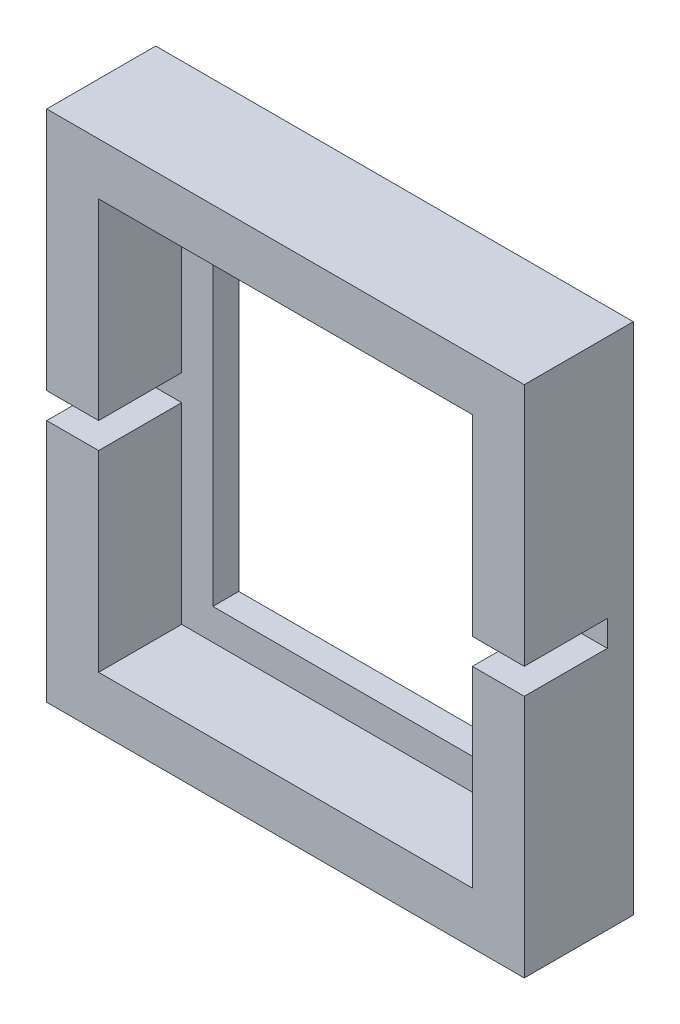
ISO-10303-21;
HEADER;
FILE_DESCRIPTION(('STEP AP214'),'2;1');
FILE_NAME('part.step','',(''),(''),'','','');
FILE_SCHEMA(('AUTOMOTIVE_DESIGN { 1 0 10303 214 1 1 1 1 }'));
ENDSEC;
DATA;
#1=APPLICATION_CONTEXT('core data for automotive mechanical design processes');
#2=APPLICATION_PROTOCOL_DEFINITION('international standard','automotive_design',2000,#1);
#3=PRODUCT_CONTEXT('',#1,'mechanical');
#4=PRODUCT('Part','Part','',(#3));
#5=PRODUCT_RELATED_PRODUCT_CATEGORY('part','',(#4));
#6=PRODUCT_DEFINITION_FORMATION('','',#4);
#7=PRODUCT_DEFINITION_CONTEXT('part definition',#1,'design');
#8=PRODUCT_DEFINITION('design','',#6,#7);
#9=PRODUCT_DEFINITION_SHAPE('','',#8);
#10=(LENGTH_UNIT() NAMED_UNIT(*) SI_UNIT(.MILLI.,.METRE.));
#11=(NAMED_UNIT(*) PLANE_ANGLE_UNIT() SI_UNIT($,.RADIAN.));
#12=(NAMED_UNIT(*) SI_UNIT($,.STERADIAN.) SOLID_ANGLE_UNIT());
#13=UNCERTAINTY_MEASURE_WITH_UNIT(LENGTH_MEASURE(1.E-05),#10,'distance_accuracy_value','');
#14=(GEOMETRIC_REPRESENTATION_CONTEXT(3) GLOBAL_UNCERTAINTY_ASSIGNED_CONTEXT((#13)) GLOBAL_UNIT_ASSIGNED_CONTEXT((#10,
#11,#12)) REPRESENTATION_CONTEXT('',''));
#15=CARTESIAN_POINT('',(0.,0.,0.));
#16=DIRECTION('',(0.,0.,1.));
#17=DIRECTION('',(1.,0.,0.));
#18=AXIS2_PLACEMENT_3D('',#15,#16,#17);
#19=CARTESIAN_POINT('',(0.,0.,0.));
#20=DIRECTION('',(0.,0.,-1.));
#21=DIRECTION('',(-1.,0.,0.));
#22=AXIS2_PLACEMENT_3D('',#19,#20,#21);
#23=PLANE('',#22);
#24=DIRECTION('',(0.,-1.,0.));
#25=VECTOR('',#24,1.);
#26=CARTESIAN_POINT('',(33.,36.5,0.));
#27=LINE('',#26,#25);
#28=CARTESIAN_POINT('',(33.,36.5,0.));
#29=VERTEX_POINT('',#28);
#30=CARTESIAN_POINT('',(33.,3.,0.));
#31=VERTEX_POINT('',#30);
#32=EDGE_CURVE('E182',#29,#31,#27,.T.);
#33=ORIENTED_EDGE('',*,*,#32,.T.);
#34=DIRECTION('',(-1.,0.,0.));
#35=VECTOR('',#34,1.);
#36=CARTESIAN_POINT('',(33.,3.,0.));
#37=LINE('',#36,#35);
#38=CARTESIAN_POINT('',(3.,3.,0.));
#39=VERTEX_POINT('',#38);
#40=EDGE_CURVE('E248',#31,#39,#37,.T.);
#41=ORIENTED_EDGE('',*,*,#40,.T.);
#42=DIRECTION('',(0.,1.,0.));
#43=VECTOR('',#42,1.);
#44=CARTESIAN_POINT('',(3.,36.5,0.));
#45=LINE('',#44,#43);
#46=CARTESIAN_POINT('',(3.,36.5,0.));
#47=VERTEX_POINT('',#46);
#48=EDGE_CURVE('E251',#39,#47,#45,.T.);
#49=ORIENTED_EDGE('',*,*,#48,.T.);
#50=DIRECTION('',(1.,0.,0.));
#51=VECTOR('',#50,1.);
#52=CARTESIAN_POINT('',(33.,36.5,0.));
#53=LINE('',#52,#51);
#54=EDGE_CURVE('E238',#47,#29,#53,.T.);
#55=ORIENTED_EDGE('',*,*,#54,.T.);
#56=EDGE_LOOP('',(#33,#41,#49,#55));
#57=FACE_BOUND('',#56,.T.);
#58=DIRECTION('',(-1.,0.,0.));
#59=VECTOR('',#58,1.);
#60=CARTESIAN_POINT('',(0.,18.5,0.));
#61=LINE('',#60,#59);
#62=CARTESIAN_POINT('',(41.,18.5,0.));
#63=VERTEX_POINT('',#62);
#64=CARTESIAN_POINT('',(36.,18.5,0.));
#65=VERTEX_POINT('',#64);
#66=EDGE_CURVE('E217',#63,#65,#61,.T.);
#67=ORIENTED_EDGE('',*,*,#66,.F.);
#68=DIRECTION('',(0.,-1.,0.));
#69=VECTOR('',#68,1.);
#70=CARTESIAN_POINT('',(41.,44.5,0.));
#71=LINE('',#70,#69);
#72=CARTESIAN_POINT('',(41.,21.,0.));
#73=VERTEX_POINT('',#72);
#74=EDGE_CURVE('E178',#73,#63,#71,.T.);
#75=ORIENTED_EDGE('',*,*,#74,.F.);
#76=DIRECTION('',(-1.,0.,0.));
#77=VECTOR('',#76,1.);
#78=CARTESIAN_POINT('',(0.,21.,0.));
#79=LINE('',#78,#77);
#80=CARTESIAN_POINT('',(36.,21.,0.));
#81=VERTEX_POINT('',#80);
#82=EDGE_CURVE('E307',#73,#81,#79,.T.);
#83=ORIENTED_EDGE('',*,*,#82,.T.);
#84=DIRECTION('',(0.,1.,0.));
#85=VECTOR('',#84,1.);
#86=CARTESIAN_POINT('',(36.,0.,0.));
#87=LINE('',#86,#85);
#88=CARTESIAN_POINT('',(36.,39.5,0.));
#89=VERTEX_POINT('',#88);
#90=EDGE_CURVE('E287',#81,#89,#87,.T.);
#91=ORIENTED_EDGE('',*,*,#90,.T.);
#92=DIRECTION('',(1.,0.,0.));
#93=VECTOR('',#92,1.);
#94=CARTESIAN_POINT('',(0.,39.5,0.));
#95=LINE('',#94,#93);
#96=CARTESIAN_POINT('',(0.,39.5,0.));
#97=VERTEX_POINT('',#96);
#98=EDGE_CURVE('E334',#97,#89,#95,.T.);
#99=ORIENTED_EDGE('',*,*,#98,.F.);
#100=DIRECTION('',(0.,1.,0.));
#101=VECTOR('',#100,1.);
#102=CARTESIAN_POINT('',(0.,0.,0.));
#103=LINE('',#102,#101);
#104=CARTESIAN_POINT('',(0.,21.,0.));
#105=VERTEX_POINT('',#104);
#106=EDGE_CURVE('E305',#105,#97,#103,.T.);
#107=ORIENTED_EDGE('',*,*,#106,.F.);
#108=DIRECTION('',(1.,0.,0.));
#109=VECTOR('',#108,1.);
#110=CARTESIAN_POINT('',(0.,21.,0.));
#111=LINE('',#110,#109);
#112=CARTESIAN_POINT('',(-5.,21.,0.));
#113=VERTEX_POINT('',#112);
#114=EDGE_CURVE('E309',#113,#105,#111,.T.);
#115=ORIENTED_EDGE('',*,*,#114,.F.);
#116=DIRECTION('',(0.,1.,0.));
#117=VECTOR('',#116,1.);
#118=CARTESIAN_POINT('',(-5.,44.5,0.));
#119=LINE('',#118,#117);
#120=CARTESIAN_POINT('',(-5.,18.5,0.));
#121=VERTEX_POINT('',#120);
#122=EDGE_CURVE('E39',#121,#113,#119,.T.);
#123=ORIENTED_EDGE('',*,*,#122,.F.);
#124=DIRECTION('',(1.,0.,0.));
#125=VECTOR('',#124,1.);
#126=CARTESIAN_POINT('',(0.,18.5,0.));
#127=LINE('',#126,#125);
#128=CARTESIAN_POINT('',(0.,18.5,0.));
#129=VERTEX_POINT('',#128);
#130=EDGE_CURVE('E198',#121,#129,#127,.T.);
#131=ORIENTED_EDGE('',*,*,#130,.T.);
#132=DIRECTION('',(0.,1.,0.));
#133=VECTOR('',#132,1.);
#134=CARTESIAN_POINT('',(0.,0.,0.));
#135=LINE('',#134,#133);
#136=CARTESIAN_POINT('',(0.,0.,0.));
#137=VERTEX_POINT('',#136);
#138=EDGE_CURVE('E201',#137,#129,#135,.T.);
#139=ORIENTED_EDGE('',*,*,#138,.F.);
#140=DIRECTION('',(1.,0.,0.));
#141=VECTOR('',#140,1.);
#142=CARTESIAN_POINT('',(0.,0.,0.));
#143=LINE('',#142,#141);
#144=CARTESIAN_POINT('',(36.,0.,0.));
#145=VERTEX_POINT('',#144);
#146=EDGE_CURVE('E222',#137,#145,#143,.T.);
#147=ORIENTED_EDGE('',*,*,#146,.T.);
#148=DIRECTION('',(0.,1.,0.));
#149=VECTOR('',#148,1.);
#150=CARTESIAN_POINT('',(36.,0.,0.));
#151=LINE('',#150,#149);
#152=EDGE_CURVE('E219',#145,#65,#151,.T.);
#153=ORIENTED_EDGE('',*,*,#152,.T.);
#154=EDGE_LOOP('',(#67,#75,#83,#91,#99,#107,#115,#123,#131,#139,#147,#153));
#155=FACE_BOUND('',#154,.T.);
#156=ADVANCED_FACE('F35',(#57,#155),#23,.F.);
#157=CARTESIAN_POINT('',(0.,21.,8.));
#158=DIRECTION('',(0.,-1.,0.));
#159=DIRECTION('',(0.,0.,-1.));
#160=AXIS2_PLACEMENT_3D('',#157,#158,#159);
#161=PLANE('',#160);
#162=ORIENTED_EDGE('',*,*,#82,.F.);
#163=DIRECTION('',(0.,0.,-1.));
#164=VECTOR('',#163,1.);
#165=CARTESIAN_POINT('',(41.,21.,8.));
#166=LINE('',#165,#164);
#167=CARTESIAN_POINT('',(41.,21.,8.));
#168=VERTEX_POINT('',#167);
#169=EDGE_CURVE('E11',#168,#73,#166,.T.);
#170=ORIENTED_EDGE('',*,*,#169,.F.);
#171=DIRECTION('',(-1.,0.,0.));
#172=VECTOR('',#171,1.);
#173=CARTESIAN_POINT('',(0.,21.,8.));
#174=LINE('',#173,#172);
#175=CARTESIAN_POINT('',(36.,21.,8.));
#176=VERTEX_POINT('',#175);
#177=EDGE_CURVE('E284',#168,#176,#174,.T.);
#178=ORIENTED_EDGE('',*,*,#177,.T.);
#179=DIRECTION('',(0.,0.,-1.));
#180=VECTOR('',#179,1.);
#181=CARTESIAN_POINT('',(36.,21.,8.));
#182=LINE('',#181,#180);
#183=EDGE_CURVE('E54',#176,#81,#182,.T.);
#184=ORIENTED_EDGE('',*,*,#183,.T.);
#185=EDGE_LOOP('',(#162,#170,#178,#184));
#186=FACE_BOUND('',#185,.T.);
#187=ADVANCED_FACE('F37',(#186),#161,.T.);
#188=CARTESIAN_POINT('',(41.,0.,8.));
#189=DIRECTION('',(1.,0.,0.));
#190=DIRECTION('',(0.,0.,-1.));
#191=AXIS2_PLACEMENT_3D('',#188,#189,#190);
#192=PLANE('',#191);
#193=ORIENTED_EDGE('',*,*,#169,.T.);
#194=ORIENTED_EDGE('',*,*,#74,.T.);
#195=DIRECTION('',(0.,0.,-1.));
#196=VECTOR('',#195,1.);
#197=CARTESIAN_POINT('',(41.,18.5,8.));
#198=LINE('',#197,#196);
#199=CARTESIAN_POINT('',(41.,18.5,8.));
#200=VERTEX_POINT('',#199);
#201=EDGE_CURVE('E172',#200,#63,#198,.T.);
#202=ORIENTED_EDGE('',*,*,#201,.F.);
#203=DIRECTION('',(0.,-1.,0.));
#204=VECTOR('',#203,1.);
#205=CARTESIAN_POINT('',(41.,0.,8.));
#206=LINE('',#205,#204);
#207=CARTESIAN_POINT('',(41.,-5.,8.));
#208=VERTEX_POINT('',#207);
#209=EDGE_CURVE('E177',#200,#208,#206,.T.);
#210=ORIENTED_EDGE('',*,*,#209,.T.);
#211=DIRECTION('',(0.,0.,1.));
#212=VECTOR('',#211,1.);
#213=CARTESIAN_POINT('',(41.,-5.,-2.5));
#214=LINE('',#213,#212);
#215=CARTESIAN_POINT('',(41.,-5.,-2.5));
#216=VERTEX_POINT('',#215);
#217=EDGE_CURVE('E283',#216,#208,#214,.T.);
#218=ORIENTED_EDGE('',*,*,#217,.F.);
#219=DIRECTION('',(0.,-1.,0.));
#220=VECTOR('',#219,1.);
#221=CARTESIAN_POINT('',(41.,44.5,-2.5));
#222=LINE('',#221,#220);
#223=CARTESIAN_POINT('',(41.,44.5,-2.5));
#224=VERTEX_POINT('',#223);
#225=EDGE_CURVE('E265',#224,#216,#222,.T.);
#226=ORIENTED_EDGE('',*,*,#225,.F.);
#227=DIRECTION('',(0.,0.,-1.));
#228=VECTOR('',#227,1.);
#229=CARTESIAN_POINT('',(41.,44.5,8.));
#230=LINE('',#229,#228);
#231=CARTESIAN_POINT('',(41.,44.5,8.));
#232=VERTEX_POINT('',#231);
#233=EDGE_CURVE('E46',#232,#224,#230,.T.);
#234=ORIENTED_EDGE('',*,*,#233,.F.);
#235=DIRECTION('',(0.,-1.,0.));
#236=VECTOR('',#235,1.);
#237=CARTESIAN_POINT('',(41.,0.,8.));
#238=LINE('',#237,#236);
#239=EDGE_CURVE('E286',#232,#168,#238,.T.);
#240=ORIENTED_EDGE('',*,*,#239,.T.);
#241=EDGE_LOOP('',(#193,#194,#202,#210,#218,#226,#234,#240));
#242=FACE_BOUND('',#241,.T.);
#243=ADVANCED_FACE('F174',(#242),#192,.T.);
#244=CARTESIAN_POINT('',(0.,44.5,8.));
#245=DIRECTION('',(0.,1.,0.));
#246=DIRECTION('',(0.,0.,1.));
#247=AXIS2_PLACEMENT_3D('',#244,#245,#246);
#248=PLANE('',#247);
#249=ORIENTED_EDGE('',*,*,#233,.T.);
#250=DIRECTION('',(1.,0.,0.));
#251=VECTOR('',#250,1.);
#252=CARTESIAN_POINT('',(41.,44.5,-2.5));
#253=LINE('',#252,#251);
#254=CARTESIAN_POINT('',(-5.,44.5,-2.5));
#255=VERTEX_POINT('',#254);
#256=EDGE_CURVE('E273',#255,#224,#253,.T.);
#257=ORIENTED_EDGE('',*,*,#256,.F.);
#258=DIRECTION('',(0.,0.,-1.));
#259=VECTOR('',#258,1.);
#260=CARTESIAN_POINT('',(-5.,44.5,8.));
#261=LINE('',#260,#259);
#262=CARTESIAN_POINT('',(-5.,44.5,8.));
#263=VERTEX_POINT('',#262);
#264=EDGE_CURVE('E317',#263,#255,#261,.T.);
#265=ORIENTED_EDGE('',*,*,#264,.F.);
#266=DIRECTION('',(1.,0.,0.));
#267=VECTOR('',#266,1.);
#268=CARTESIAN_POINT('',(0.,44.5,8.));
#269=LINE('',#268,#267);
#270=EDGE_CURVE('E290',#263,#232,#269,.T.);
#271=ORIENTED_EDGE('',*,*,#270,.T.);
#272=EDGE_LOOP('',(#249,#257,#265,#271));
#273=FACE_BOUND('',#272,.T.);
#274=ADVANCED_FACE('F418',(#273),#248,.T.);
#275=CARTESIAN_POINT('',(-5.,0.,8.));
#276=DIRECTION('',(1.,0.,0.));
#277=DIRECTION('',(0.,0.,-1.));
#278=AXIS2_PLACEMENT_3D('',#275,#276,#277);
#279=PLANE('',#278);
#280=ORIENTED_EDGE('',*,*,#264,.T.);
#281=DIRECTION('',(0.,1.,0.));
#282=VECTOR('',#281,1.);
#283=CARTESIAN_POINT('',(-5.,44.5,-2.5));
#284=LINE('',#283,#282);
#285=CARTESIAN_POINT('',(-5.,-5.,-2.5));
#286=VERTEX_POINT('',#285);
#287=EDGE_CURVE('E270',#286,#255,#284,.T.);
#288=ORIENTED_EDGE('',*,*,#287,.F.);
#289=DIRECTION('',(0.,0.,1.));
#290=VECTOR('',#289,1.);
#291=CARTESIAN_POINT('',(-5.,-5.,-2.5));
#292=LINE('',#291,#290);
#293=CARTESIAN_POINT('',(-5.,-5.,8.));
#294=VERTEX_POINT('',#293);
#295=EDGE_CURVE('E276',#286,#294,#292,.T.);
#296=ORIENTED_EDGE('',*,*,#295,.T.);
#297=DIRECTION('',(0.,-1.,0.));
#298=VECTOR('',#297,1.);
#299=CARTESIAN_POINT('',(-5.,0.,8.));
#300=LINE('',#299,#298);
#301=CARTESIAN_POINT('',(-5.,18.5,8.));
#302=VERTEX_POINT('',#301);
#303=EDGE_CURVE('E213',#302,#294,#300,.T.);
#304=ORIENTED_EDGE('',*,*,#303,.F.);
#305=DIRECTION('',(0.,0.,-1.));
#306=VECTOR('',#305,1.);
#307=CARTESIAN_POINT('',(-5.,18.5,8.));
#308=LINE('',#307,#306);
#309=EDGE_CURVE('E216',#302,#121,#308,.T.);
#310=ORIENTED_EDGE('',*,*,#309,.T.);
#311=ORIENTED_EDGE('',*,*,#122,.T.);
#312=DIRECTION('',(0.,0.,-1.));
#313=VECTOR('',#312,1.);
#314=CARTESIAN_POINT('',(-5.,21.,8.));
#315=LINE('',#314,#313);
#316=CARTESIAN_POINT('',(-5.,21.,8.));
#317=VERTEX_POINT('',#316);
#318=EDGE_CURVE('E314',#317,#113,#315,.T.);
#319=ORIENTED_EDGE('',*,*,#318,.F.);
#320=DIRECTION('',(0.,-1.,0.));
#321=VECTOR('',#320,1.);
#322=CARTESIAN_POINT('',(-5.,0.,8.));
#323=LINE('',#322,#321);
#324=EDGE_CURVE('E293',#263,#317,#323,.T.);
#325=ORIENTED_EDGE('',*,*,#324,.F.);
#326=EDGE_LOOP('',(#280,#288,#296,#304,#310,#311,#319,#325));
#327=FACE_BOUND('',#326,.T.);
#328=ADVANCED_FACE('F363',(#327),#279,.F.);
#329=CARTESIAN_POINT('',(0.,21.,8.));
#330=DIRECTION('',(0.,1.,0.));
#331=DIRECTION('',(0.,0.,1.));
#332=AXIS2_PLACEMENT_3D('',#329,#330,#331);
#333=PLANE('',#332);
#334=ORIENTED_EDGE('',*,*,#114,.T.);
#335=DIRECTION('',(0.,0.,-1.));
#336=VECTOR('',#335,1.);
#337=CARTESIAN_POINT('',(0.,21.,8.));
#338=LINE('',#337,#336);
#339=CARTESIAN_POINT('',(0.,21.,8.));
#340=VERTEX_POINT('',#339);
#341=EDGE_CURVE('E318',#340,#105,#338,.T.);
#342=ORIENTED_EDGE('',*,*,#341,.F.);
#343=DIRECTION('',(1.,0.,0.));
#344=VECTOR('',#343,1.);
#345=CARTESIAN_POINT('',(0.,21.,8.));
#346=LINE('',#345,#344);
#347=EDGE_CURVE('E295',#317,#340,#346,.T.);
#348=ORIENTED_EDGE('',*,*,#347,.F.);
#349=ORIENTED_EDGE('',*,*,#318,.T.);
#350=EDGE_LOOP('',(#334,#342,#348,#349));
#351=FACE_BOUND('',#350,.T.);
#352=ADVANCED_FACE('F358',(#351),#333,.F.);
#353=CARTESIAN_POINT('',(0.,0.,8.));
#354=DIRECTION('',(-1.,0.,0.));
#355=DIRECTION('',(0.,0.,1.));
#356=AXIS2_PLACEMENT_3D('',#353,#354,#355);
#357=PLANE('',#356);
#358=ORIENTED_EDGE('',*,*,#106,.T.);
#359=DIRECTION('',(0.,0.,-1.));
#360=VECTOR('',#359,1.);
#361=CARTESIAN_POINT('',(0.,39.5,8.));
#362=LINE('',#361,#360);
#363=CARTESIAN_POINT('',(0.,39.5,8.));
#364=VERTEX_POINT('',#363);
#365=EDGE_CURVE('E327',#364,#97,#362,.T.);
#366=ORIENTED_EDGE('',*,*,#365,.F.);
#367=DIRECTION('',(0.,1.,0.));
#368=VECTOR('',#367,1.);
#369=CARTESIAN_POINT('',(0.,0.,8.));
#370=LINE('',#369,#368);
#371=EDGE_CURVE('E297',#340,#364,#370,.T.);
#372=ORIENTED_EDGE('',*,*,#371,.F.);
#373=ORIENTED_EDGE('',*,*,#341,.T.);
#374=EDGE_LOOP('',(#358,#366,#372,#373));
#375=FACE_BOUND('',#374,.T.);
#376=ADVANCED_FACE('F342',(#375),#357,.F.);
#377=CARTESIAN_POINT('',(0.,39.5,8.));
#378=DIRECTION('',(0.,1.,0.));
#379=DIRECTION('',(0.,0.,1.));
#380=AXIS2_PLACEMENT_3D('',#377,#378,#379);
#381=PLANE('',#380);
#382=ORIENTED_EDGE('',*,*,#98,.T.);
#383=DIRECTION('',(0.,0.,-1.));
#384=VECTOR('',#383,1.);
#385=CARTESIAN_POINT('',(36.,39.5,8.));
#386=LINE('',#385,#384);
#387=CARTESIAN_POINT('',(36.,39.5,8.));
#388=VERTEX_POINT('',#387);
#389=EDGE_CURVE('E330',#388,#89,#386,.T.);
#390=ORIENTED_EDGE('',*,*,#389,.F.);
#391=DIRECTION('',(1.,0.,0.));
#392=VECTOR('',#391,1.);
#393=CARTESIAN_POINT('',(0.,39.5,8.));
#394=LINE('',#393,#392);
#395=EDGE_CURVE('E299',#364,#388,#394,.T.);
#396=ORIENTED_EDGE('',*,*,#395,.F.);
#397=ORIENTED_EDGE('',*,*,#365,.T.);
#398=EDGE_LOOP('',(#382,#390,#396,#397));
#399=FACE_BOUND('',#398,.T.);
#400=ADVANCED_FACE('F348',(#399),#381,.F.);
#401=CARTESIAN_POINT('',(36.,0.,8.));
#402=DIRECTION('',(-1.,0.,0.));
#403=DIRECTION('',(0.,0.,1.));
#404=AXIS2_PLACEMENT_3D('',#401,#402,#403);
#405=PLANE('',#404);
#406=ORIENTED_EDGE('',*,*,#90,.F.);
#407=ORIENTED_EDGE('',*,*,#183,.F.);
#408=DIRECTION('',(0.,1.,0.));
#409=VECTOR('',#408,1.);
#410=CARTESIAN_POINT('',(36.,0.,8.));
#411=LINE('',#410,#409);
#412=EDGE_CURVE('E301',#176,#388,#411,.T.);
#413=ORIENTED_EDGE('',*,*,#412,.T.);
#414=ORIENTED_EDGE('',*,*,#389,.T.);
#415=EDGE_LOOP('',(#406,#407,#413,#414));
#416=FACE_BOUND('',#415,.T.);
#417=ADVANCED_FACE('F382',(#416),#405,.T.);
#418=CARTESIAN_POINT('',(0.,0.,8.));
#419=DIRECTION('',(0.,0.,1.));
#420=DIRECTION('',(1.,0.,0.));
#421=AXIS2_PLACEMENT_3D('',#418,#419,#420);
#422=PLANE('',#421);
#423=ORIENTED_EDGE('',*,*,#177,.F.);
#424=ORIENTED_EDGE('',*,*,#239,.F.);
#425=ORIENTED_EDGE('',*,*,#270,.F.);
#426=ORIENTED_EDGE('',*,*,#324,.T.);
#427=ORIENTED_EDGE('',*,*,#347,.T.);
#428=ORIENTED_EDGE('',*,*,#371,.T.);
#429=ORIENTED_EDGE('',*,*,#395,.T.);
#430=ORIENTED_EDGE('',*,*,#412,.F.);
#431=EDGE_LOOP('',(#423,#424,#425,#426,#427,#428,#429,#430));
#432=FACE_BOUND('',#431,.T.);
#433=ADVANCED_FACE('F352',(#432),#422,.T.);
#434=CARTESIAN_POINT('',(0.,0.,-2.5));
#435=DIRECTION('',(0.,0.,-1.));
#436=DIRECTION('',(-1.,0.,0.));
#437=AXIS2_PLACEMENT_3D('',#434,#435,#436);
#438=PLANE('',#437);
#439=ORIENTED_EDGE('',*,*,#225,.T.);
#440=DIRECTION('',(-1.,0.,0.));
#441=VECTOR('',#440,1.);
#442=CARTESIAN_POINT('',(41.,-5.,-2.5));
#443=LINE('',#442,#441);
#444=EDGE_CURVE('E268',#216,#286,#443,.T.);
#445=ORIENTED_EDGE('',*,*,#444,.T.);
#446=ORIENTED_EDGE('',*,*,#287,.T.);
#447=ORIENTED_EDGE('',*,*,#256,.T.);
#448=EDGE_LOOP('',(#439,#445,#446,#447));
#449=FACE_BOUND('',#448,.T.);
#450=DIRECTION('',(-1.,0.,0.));
#451=VECTOR('',#450,1.);
#452=CARTESIAN_POINT('',(33.,3.,-2.5));
#453=LINE('',#452,#451);
#454=CARTESIAN_POINT('',(33.,3.,-2.5));
#455=VERTEX_POINT('',#454);
#456=CARTESIAN_POINT('',(3.,3.,-2.5));
#457=VERTEX_POINT('',#456);
#458=EDGE_CURVE('E237',#455,#457,#453,.T.);
#459=ORIENTED_EDGE('',*,*,#458,.F.);
#460=DIRECTION('',(0.,-1.,0.));
#461=VECTOR('',#460,1.);
#462=CARTESIAN_POINT('',(33.,36.5,-2.5));
#463=LINE('',#462,#461);
#464=CARTESIAN_POINT('',(33.,36.5,-2.5));
#465=VERTEX_POINT('',#464);
#466=EDGE_CURVE('E235',#465,#455,#463,.T.);
#467=ORIENTED_EDGE('',*,*,#466,.F.);
#468=DIRECTION('',(1.,0.,0.));
#469=VECTOR('',#468,1.);
#470=CARTESIAN_POINT('',(33.,36.5,-2.5));
#471=LINE('',#470,#469);
#472=CARTESIAN_POINT('',(3.,36.5,-2.5));
#473=VERTEX_POINT('',#472);
#474=EDGE_CURVE('E243',#473,#465,#471,.T.);
#475=ORIENTED_EDGE('',*,*,#474,.F.);
#476=DIRECTION('',(0.,1.,0.));
#477=VECTOR('',#476,1.);
#478=CARTESIAN_POINT('',(3.,36.5,-2.5));
#479=LINE('',#478,#477);
#480=EDGE_CURVE('E240',#457,#473,#479,.T.);
#481=ORIENTED_EDGE('',*,*,#480,.F.);
#482=EDGE_LOOP('',(#459,#467,#475,#481));
#483=FACE_BOUND('',#482,.T.);
#484=ADVANCED_FACE('F389',(#449,#483),#438,.T.);
#485=CARTESIAN_POINT('',(41.,-5.,-2.5));
#486=DIRECTION('',(0.,1.,0.));
#487=DIRECTION('',(0.,0.,1.));
#488=AXIS2_PLACEMENT_3D('',#485,#486,#487);
#489=PLANE('',#488);
#490=ORIENTED_EDGE('',*,*,#217,.T.);
#491=DIRECTION('',(1.,0.,0.));
#492=VECTOR('',#491,1.);
#493=CARTESIAN_POINT('',(0.,-5.,8.));
#494=LINE('',#493,#492);
#495=EDGE_CURVE('E197',#294,#208,#494,.T.);
#496=ORIENTED_EDGE('',*,*,#495,.F.);
#497=ORIENTED_EDGE('',*,*,#295,.F.);
#498=ORIENTED_EDGE('',*,*,#444,.F.);
#499=EDGE_LOOP('',(#490,#496,#497,#498));
#500=FACE_BOUND('',#499,.T.);
#501=ADVANCED_FACE('F401',(#500),#489,.F.);
#502=CARTESIAN_POINT('',(33.,36.5,-2.5));
#503=DIRECTION('',(-1.,0.,0.));
#504=DIRECTION('',(0.,0.,1.));
#505=AXIS2_PLACEMENT_3D('',#502,#503,#504);
#506=PLANE('',#505);
#507=ORIENTED_EDGE('',*,*,#32,.F.);
#508=DIRECTION('',(0.,0.,1.));
#509=VECTOR('',#508,1.);
#510=CARTESIAN_POINT('',(33.,36.5,-2.5));
#511=LINE('',#510,#509);
#512=EDGE_CURVE('E245',#465,#29,#511,.T.);
#513=ORIENTED_EDGE('',*,*,#512,.F.);
#514=ORIENTED_EDGE('',*,*,#466,.T.);
#515=DIRECTION('',(0.,0.,1.));
#516=VECTOR('',#515,1.);
#517=CARTESIAN_POINT('',(33.,3.,-2.5));
#518=LINE('',#517,#516);
#519=EDGE_CURVE('E262',#455,#31,#518,.T.);
#520=ORIENTED_EDGE('',*,*,#519,.T.);
#521=EDGE_LOOP('',(#507,#513,#514,#520));
#522=FACE_BOUND('',#521,.T.);
#523=ADVANCED_FACE('F403',(#522),#506,.T.);
#524=CARTESIAN_POINT('',(33.,3.,-2.5));
#525=DIRECTION('',(0.,1.,0.));
#526=DIRECTION('',(0.,0.,1.));
#527=AXIS2_PLACEMENT_3D('',#524,#525,#526);
#528=PLANE('',#527);
#529=ORIENTED_EDGE('',*,*,#40,.F.);
#530=ORIENTED_EDGE('',*,*,#519,.F.);
#531=ORIENTED_EDGE('',*,*,#458,.T.);
#532=DIRECTION('',(0.,0.,1.));
#533=VECTOR('',#532,1.);
#534=CARTESIAN_POINT('',(3.,3.,-2.5));
#535=LINE('',#534,#533);
#536=EDGE_CURVE('E260',#457,#39,#535,.T.);
#537=ORIENTED_EDGE('',*,*,#536,.T.);
#538=EDGE_LOOP('',(#529,#530,#531,#537));
#539=FACE_BOUND('',#538,.T.);
#540=ADVANCED_FACE('F409',(#539),#528,.T.);
#541=CARTESIAN_POINT('',(3.,36.5,-2.5));
#542=DIRECTION('',(1.,0.,0.));
#543=DIRECTION('',(0.,0.,-1.));
#544=AXIS2_PLACEMENT_3D('',#541,#542,#543);
#545=PLANE('',#544);
#546=ORIENTED_EDGE('',*,*,#48,.F.);
#547=ORIENTED_EDGE('',*,*,#536,.F.);
#548=ORIENTED_EDGE('',*,*,#480,.T.);
#549=DIRECTION('',(0.,0.,1.));
#550=VECTOR('',#549,1.);
#551=CARTESIAN_POINT('',(3.,36.5,-2.5));
#552=LINE('',#551,#550);
#553=EDGE_CURVE('E258',#473,#47,#552,.T.);
#554=ORIENTED_EDGE('',*,*,#553,.T.);
#555=EDGE_LOOP('',(#546,#547,#548,#554));
#556=FACE_BOUND('',#555,.T.);
#557=ADVANCED_FACE('F470',(#556),#545,.T.);
#558=CARTESIAN_POINT('',(33.,36.5,-2.5));
#559=DIRECTION('',(0.,-1.,0.));
#560=DIRECTION('',(0.,0.,-1.));
#561=AXIS2_PLACEMENT_3D('',#558,#559,#560);
#562=PLANE('',#561);
#563=ORIENTED_EDGE('',*,*,#54,.F.);
#564=ORIENTED_EDGE('',*,*,#553,.F.);
#565=ORIENTED_EDGE('',*,*,#474,.T.);
#566=ORIENTED_EDGE('',*,*,#512,.T.);
#567=EDGE_LOOP('',(#563,#564,#565,#566));
#568=FACE_BOUND('',#567,.T.);
#569=ADVANCED_FACE('F480',(#568),#562,.T.);
#570=CARTESIAN_POINT('',(0.,18.5,8.));
#571=DIRECTION('',(0.,-1.,0.));
#572=DIRECTION('',(0.,0.,-1.));
#573=AXIS2_PLACEMENT_3D('',#570,#571,#572);
#574=PLANE('',#573);
#575=ORIENTED_EDGE('',*,*,#66,.T.);
#576=DIRECTION('',(0.,0.,-1.));
#577=VECTOR('',#576,1.);
#578=CARTESIAN_POINT('',(36.,18.5,8.));
#579=LINE('',#578,#577);
#580=CARTESIAN_POINT('',(36.,18.5,8.));
#581=VERTEX_POINT('',#580);
#582=EDGE_CURVE('E183',#581,#65,#579,.T.);
#583=ORIENTED_EDGE('',*,*,#582,.F.);
#584=DIRECTION('',(-1.,0.,0.));
#585=VECTOR('',#584,1.);
#586=CARTESIAN_POINT('',(0.,18.5,8.));
#587=LINE('',#586,#585);
#588=EDGE_CURVE('E186',#200,#581,#587,.T.);
#589=ORIENTED_EDGE('',*,*,#588,.F.);
#590=ORIENTED_EDGE('',*,*,#201,.T.);
#591=EDGE_LOOP('',(#575,#583,#589,#590));
#592=FACE_BOUND('',#591,.T.);
#593=ADVANCED_FACE('F187',(#592),#574,.F.);
#594=CARTESIAN_POINT('',(36.,0.,8.));
#595=DIRECTION('',(-1.,0.,0.));
#596=DIRECTION('',(0.,0.,1.));
#597=AXIS2_PLACEMENT_3D('',#594,#595,#596);
#598=PLANE('',#597);
#599=ORIENTED_EDGE('',*,*,#152,.F.);
#600=DIRECTION('',(0.,0.,-1.));
#601=VECTOR('',#600,1.);
#602=CARTESIAN_POINT('',(36.,0.,8.));
#603=LINE('',#602,#601);
#604=CARTESIAN_POINT('',(36.,0.,8.));
#605=VERTEX_POINT('',#604);
#606=EDGE_CURVE('E232',#605,#145,#603,.T.);
#607=ORIENTED_EDGE('',*,*,#606,.F.);
#608=DIRECTION('',(0.,1.,0.));
#609=VECTOR('',#608,1.);
#610=CARTESIAN_POINT('',(36.,0.,8.));
#611=LINE('',#610,#609);
#612=EDGE_CURVE('E191',#605,#581,#611,.T.);
#613=ORIENTED_EDGE('',*,*,#612,.T.);
#614=ORIENTED_EDGE('',*,*,#582,.T.);
#615=EDGE_LOOP('',(#599,#607,#613,#614));
#616=FACE_BOUND('',#615,.T.);
#617=ADVANCED_FACE('F378',(#616),#598,.T.);
#618=CARTESIAN_POINT('',(0.,0.,8.));
#619=DIRECTION('',(0.,1.,0.));
#620=DIRECTION('',(0.,0.,1.));
#621=AXIS2_PLACEMENT_3D('',#618,#619,#620);
#622=PLANE('',#621);
#623=ORIENTED_EDGE('',*,*,#146,.F.);
#624=DIRECTION('',(0.,0.,-1.));
#625=VECTOR('',#624,1.);
#626=CARTESIAN_POINT('',(0.,0.,8.));
#627=LINE('',#626,#625);
#628=CARTESIAN_POINT('',(0.,0.,8.));
#629=VERTEX_POINT('',#628);
#630=EDGE_CURVE('E230',#629,#137,#627,.T.);
#631=ORIENTED_EDGE('',*,*,#630,.F.);
#632=DIRECTION('',(1.,0.,0.));
#633=VECTOR('',#632,1.);
#634=CARTESIAN_POINT('',(0.,0.,8.));
#635=LINE('',#634,#633);
#636=EDGE_CURVE('E205',#629,#605,#635,.T.);
#637=ORIENTED_EDGE('',*,*,#636,.T.);
#638=ORIENTED_EDGE('',*,*,#606,.T.);
#639=EDGE_LOOP('',(#623,#631,#637,#638));
#640=FACE_BOUND('',#639,.T.);
#641=ADVANCED_FACE('F375',(#640),#622,.T.);
#642=CARTESIAN_POINT('',(0.,0.,8.));
#643=DIRECTION('',(-1.,0.,0.));
#644=DIRECTION('',(0.,0.,1.));
#645=AXIS2_PLACEMENT_3D('',#642,#643,#644);
#646=PLANE('',#645);
#647=ORIENTED_EDGE('',*,*,#138,.T.);
#648=DIRECTION('',(0.,0.,-1.));
#649=VECTOR('',#648,1.);
#650=CARTESIAN_POINT('',(0.,18.5,8.));
#651=LINE('',#650,#649);
#652=CARTESIAN_POINT('',(0.,18.5,8.));
#653=VERTEX_POINT('',#652);
#654=EDGE_CURVE('E228',#653,#129,#651,.T.);
#655=ORIENTED_EDGE('',*,*,#654,.F.);
#656=DIRECTION('',(0.,1.,0.));
#657=VECTOR('',#656,1.);
#658=CARTESIAN_POINT('',(0.,0.,8.));
#659=LINE('',#658,#657);
#660=EDGE_CURVE('E208',#629,#653,#659,.T.);
#661=ORIENTED_EDGE('',*,*,#660,.F.);
#662=ORIENTED_EDGE('',*,*,#630,.T.);
#663=EDGE_LOOP('',(#647,#655,#661,#662));
#664=FACE_BOUND('',#663,.T.);
#665=ADVANCED_FACE('F371',(#664),#646,.F.);
#666=CARTESIAN_POINT('',(0.,18.5,8.));
#667=DIRECTION('',(0.,1.,0.));
#668=DIRECTION('',(0.,0.,1.));
#669=AXIS2_PLACEMENT_3D('',#666,#667,#668);
#670=PLANE('',#669);
#671=ORIENTED_EDGE('',*,*,#130,.F.);
#672=ORIENTED_EDGE('',*,*,#309,.F.);
#673=DIRECTION('',(1.,0.,0.));
#674=VECTOR('',#673,1.);
#675=CARTESIAN_POINT('',(0.,18.5,8.));
#676=LINE('',#675,#674);
#677=EDGE_CURVE('E210',#302,#653,#676,.T.);
#678=ORIENTED_EDGE('',*,*,#677,.T.);
#679=ORIENTED_EDGE('',*,*,#654,.T.);
#680=EDGE_LOOP('',(#671,#672,#678,#679));
#681=FACE_BOUND('',#680,.T.);
#682=ADVANCED_FACE('F367',(#681),#670,.T.);
#683=CARTESIAN_POINT('',(0.,0.,8.));
#684=DIRECTION('',(0.,0.,1.));
#685=DIRECTION('',(1.,0.,0.));
#686=AXIS2_PLACEMENT_3D('',#683,#684,#685);
#687=PLANE('',#686);
#688=ORIENTED_EDGE('',*,*,#209,.F.);
#689=ORIENTED_EDGE('',*,*,#588,.T.);
#690=ORIENTED_EDGE('',*,*,#612,.F.);
#691=ORIENTED_EDGE('',*,*,#636,.F.);
#692=ORIENTED_EDGE('',*,*,#660,.T.);
#693=ORIENTED_EDGE('',*,*,#677,.F.);
#694=ORIENTED_EDGE('',*,*,#303,.T.);
#695=ORIENTED_EDGE('',*,*,#495,.T.);
#696=EDGE_LOOP('',(#688,#689,#690,#691,#692,#693,#694,#695));
#697=FACE_BOUND('',#696,.T.);
#698=ADVANCED_FACE('F194',(#697),#687,.T.);
#699=CLOSED_SHELL('',(#156,#187,#243,#274,#328,#352,#376,#400,#417,#433,#484,#501,#523,#540,
#557,#569,#593,#617,#641,#665,#682,#698));
#700=MANIFOLD_SOLID_BREP('B2',#699);
#701=ADVANCED_BREP_SHAPE_REPRESENTATION('',(#18,#700),#14);
#702=SHAPE_DEFINITION_REPRESENTATION(#9,#701);
ENDSEC;
END-ISO-10303-21;
